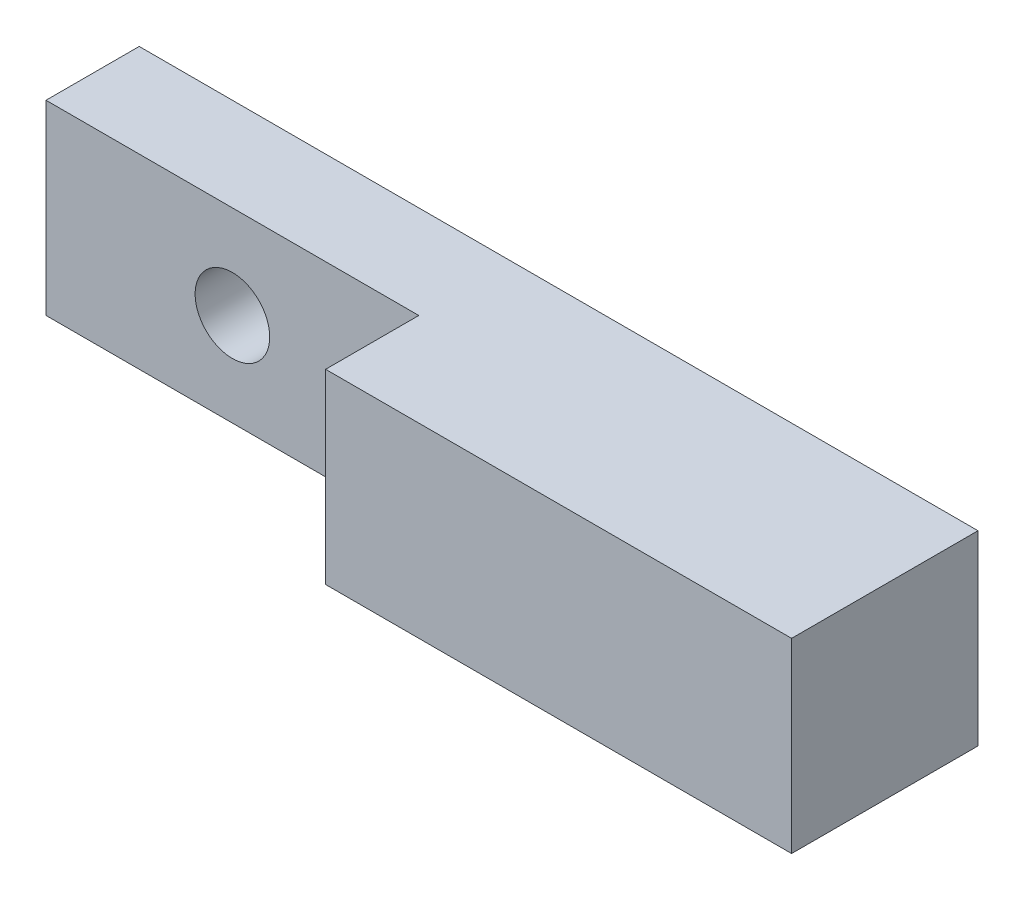
ISO-10303-21;
HEADER;
FILE_DESCRIPTION(('STEP AP214'),'2;1');
FILE_NAME('part.step','',(''),(''),'','','');
FILE_SCHEMA(('AUTOMOTIVE_DESIGN { 1 0 10303 214 1 1 1 1 }'));
ENDSEC;
DATA;
#1=APPLICATION_CONTEXT('core data for automotive mechanical design processes');
#2=APPLICATION_PROTOCOL_DEFINITION('international standard','automotive_design',2000,#1);
#3=PRODUCT_CONTEXT('',#1,'mechanical');
#4=PRODUCT('Part','Part','',(#3));
#5=PRODUCT_RELATED_PRODUCT_CATEGORY('part','',(#4));
#6=PRODUCT_DEFINITION_FORMATION('','',#4);
#7=PRODUCT_DEFINITION_CONTEXT('part definition',#1,'design');
#8=PRODUCT_DEFINITION('design','',#6,#7);
#9=PRODUCT_DEFINITION_SHAPE('','',#8);
#10=(LENGTH_UNIT() NAMED_UNIT(*) SI_UNIT(.MILLI.,.METRE.));
#11=(NAMED_UNIT(*) PLANE_ANGLE_UNIT() SI_UNIT($,.RADIAN.));
#12=(NAMED_UNIT(*) SI_UNIT($,.STERADIAN.) SOLID_ANGLE_UNIT());
#13=UNCERTAINTY_MEASURE_WITH_UNIT(LENGTH_MEASURE(1.E-05),#10,'distance_accuracy_value','');
#14=(GEOMETRIC_REPRESENTATION_CONTEXT(3) GLOBAL_UNCERTAINTY_ASSIGNED_CONTEXT((#13)) GLOBAL_UNIT_ASSIGNED_CONTEXT((#10,
#11,#12)) REPRESENTATION_CONTEXT('',''));
#15=CARTESIAN_POINT('',(0.,0.,0.));
#16=DIRECTION('',(0.,0.,1.));
#17=DIRECTION('',(1.,0.,0.));
#18=AXIS2_PLACEMENT_3D('',#15,#16,#17);
#19=CARTESIAN_POINT('',(0.,0.,10.));
#20=DIRECTION('',(1.,0.,0.));
#21=DIRECTION('',(0.,0.,-1.));
#22=AXIS2_PLACEMENT_3D('',#19,#20,#21);
#23=PLANE('',#22);
#24=DIRECTION('',(0.,-1.,0.));
#25=VECTOR('',#24,1.);
#26=CARTESIAN_POINT('',(0.,10.,5.));
#27=LINE('',#26,#25);
#28=CARTESIAN_POINT('',(0.,10.,5.));
#29=VERTEX_POINT('',#28);
#30=CARTESIAN_POINT('',(0.,0.,5.));
#31=VERTEX_POINT('',#30);
#32=EDGE_CURVE('E80',#29,#31,#27,.T.);
#33=ORIENTED_EDGE('',*,*,#32,.F.);
#34=DIRECTION('',(0.,0.,-1.));
#35=VECTOR('',#34,1.);
#36=CARTESIAN_POINT('',(0.,10.,10.));
#37=LINE('',#36,#35);
#38=CARTESIAN_POINT('',(0.,10.,0.));
#39=VERTEX_POINT('',#38);
#40=EDGE_CURVE('E74',#29,#39,#37,.T.);
#41=ORIENTED_EDGE('',*,*,#40,.T.);
#42=DIRECTION('',(0.,-1.,0.));
#43=VECTOR('',#42,1.);
#44=CARTESIAN_POINT('',(0.,0.,0.));
#45=LINE('',#44,#43);
#46=CARTESIAN_POINT('',(0.,0.,0.));
#47=VERTEX_POINT('',#46);
#48=EDGE_CURVE('E78',#39,#47,#45,.T.);
#49=ORIENTED_EDGE('',*,*,#48,.T.);
#50=DIRECTION('',(0.,0.,-1.));
#51=VECTOR('',#50,1.);
#52=CARTESIAN_POINT('',(0.,0.,10.));
#53=LINE('',#52,#51);
#54=EDGE_CURVE('E11',#31,#47,#53,.T.);
#55=ORIENTED_EDGE('',*,*,#54,.F.);
#56=EDGE_LOOP('',(#33,#41,#49,#55));
#57=FACE_BOUND('',#56,.T.);
#58=ADVANCED_FACE('F32',(#57),#23,.F.);
#59=CARTESIAN_POINT('',(0.,0.,10.));
#60=DIRECTION('',(0.,1.,0.));
#61=DIRECTION('',(0.,0.,1.));
#62=AXIS2_PLACEMENT_3D('',#59,#60,#61);
#63=PLANE('',#62);
#64=DIRECTION('',(1.,0.,0.));
#65=VECTOR('',#64,1.);
#66=CARTESIAN_POINT('',(0.,0.,10.));
#67=LINE('',#66,#65);
#68=CARTESIAN_POINT('',(20.,0.,10.));
#69=VERTEX_POINT('',#68);
#70=CARTESIAN_POINT('',(45.,0.,10.));
#71=VERTEX_POINT('',#70);
#72=EDGE_CURVE('E93',#69,#71,#67,.T.);
#73=ORIENTED_EDGE('',*,*,#72,.F.);
#74=DIRECTION('',(0.,0.,1.));
#75=VECTOR('',#74,1.);
#76=CARTESIAN_POINT('',(20.,0.,5.));
#77=LINE('',#76,#75);
#78=CARTESIAN_POINT('',(20.,0.,5.));
#79=VERTEX_POINT('',#78);
#80=EDGE_CURVE('E46',#79,#69,#77,.T.);
#81=ORIENTED_EDGE('',*,*,#80,.F.);
#82=DIRECTION('',(1.,0.,0.));
#83=VECTOR('',#82,1.);
#84=CARTESIAN_POINT('',(0.,0.,5.));
#85=LINE('',#84,#83);
#86=EDGE_CURVE('E118',#31,#79,#85,.T.);
#87=ORIENTED_EDGE('',*,*,#86,.F.);
#88=ORIENTED_EDGE('',*,*,#54,.T.);
#89=DIRECTION('',(1.,0.,0.));
#90=VECTOR('',#89,1.);
#91=CARTESIAN_POINT('',(0.,0.,0.));
#92=LINE('',#91,#90);
#93=CARTESIAN_POINT('',(45.,0.,0.));
#94=VERTEX_POINT('',#93);
#95=EDGE_CURVE('E98',#47,#94,#92,.T.);
#96=ORIENTED_EDGE('',*,*,#95,.T.);
#97=DIRECTION('',(0.,0.,-1.));
#98=VECTOR('',#97,1.);
#99=CARTESIAN_POINT('',(45.,0.,10.));
#100=LINE('',#99,#98);
#101=EDGE_CURVE('E39',#71,#94,#100,.T.);
#102=ORIENTED_EDGE('',*,*,#101,.F.);
#103=EDGE_LOOP('',(#73,#81,#87,#88,#96,#102));
#104=FACE_BOUND('',#103,.T.);
#105=ADVANCED_FACE('F114',(#104),#63,.F.);
#106=CARTESIAN_POINT('',(45.,0.,10.));
#107=DIRECTION('',(-1.,0.,0.));
#108=DIRECTION('',(0.,0.,1.));
#109=AXIS2_PLACEMENT_3D('',#106,#107,#108);
#110=PLANE('',#109);
#111=DIRECTION('',(0.,1.,0.));
#112=VECTOR('',#111,1.);
#113=CARTESIAN_POINT('',(45.,0.,0.));
#114=LINE('',#113,#112);
#115=CARTESIAN_POINT('',(45.,10.,0.));
#116=VERTEX_POINT('',#115);
#117=EDGE_CURVE('E94',#94,#116,#114,.T.);
#118=ORIENTED_EDGE('',*,*,#117,.T.);
#119=DIRECTION('',(0.,0.,-1.));
#120=VECTOR('',#119,1.);
#121=CARTESIAN_POINT('',(45.,10.,10.));
#122=LINE('',#121,#120);
#123=CARTESIAN_POINT('',(45.,10.,10.));
#124=VERTEX_POINT('',#123);
#125=EDGE_CURVE('E83',#124,#116,#122,.T.);
#126=ORIENTED_EDGE('',*,*,#125,.F.);
#127=DIRECTION('',(0.,1.,0.));
#128=VECTOR('',#127,1.);
#129=CARTESIAN_POINT('',(45.,0.,10.));
#130=LINE('',#129,#128);
#131=EDGE_CURVE('E55',#71,#124,#130,.T.);
#132=ORIENTED_EDGE('',*,*,#131,.F.);
#133=ORIENTED_EDGE('',*,*,#101,.T.);
#134=EDGE_LOOP('',(#118,#126,#132,#133));
#135=FACE_BOUND('',#134,.T.);
#136=ADVANCED_FACE('F111',(#135),#110,.F.);
#137=CARTESIAN_POINT('',(0.,10.,10.));
#138=DIRECTION('',(0.,-1.,0.));
#139=DIRECTION('',(0.,0.,-1.));
#140=AXIS2_PLACEMENT_3D('',#137,#138,#139);
#141=PLANE('',#140);
#142=DIRECTION('',(-1.,0.,0.));
#143=VECTOR('',#142,1.);
#144=CARTESIAN_POINT('',(0.,10.,5.));
#145=LINE('',#144,#143);
#146=CARTESIAN_POINT('',(20.,10.,5.));
#147=VERTEX_POINT('',#146);
#148=EDGE_CURVE('E130',#147,#29,#145,.T.);
#149=ORIENTED_EDGE('',*,*,#148,.F.);
#150=DIRECTION('',(0.,0.,1.));
#151=VECTOR('',#150,1.);
#152=CARTESIAN_POINT('',(20.,10.,5.));
#153=LINE('',#152,#151);
#154=CARTESIAN_POINT('',(20.,10.,10.));
#155=VERTEX_POINT('',#154);
#156=EDGE_CURVE('E99',#147,#155,#153,.T.);
#157=ORIENTED_EDGE('',*,*,#156,.T.);
#158=DIRECTION('',(-1.,0.,0.));
#159=VECTOR('',#158,1.);
#160=CARTESIAN_POINT('',(0.,10.,10.));
#161=LINE('',#160,#159);
#162=EDGE_CURVE('E84',#124,#155,#161,.T.);
#163=ORIENTED_EDGE('',*,*,#162,.F.);
#164=ORIENTED_EDGE('',*,*,#125,.T.);
#165=DIRECTION('',(-1.,0.,0.));
#166=VECTOR('',#165,1.);
#167=CARTESIAN_POINT('',(0.,10.,0.));
#168=LINE('',#167,#166);
#169=EDGE_CURVE('E88',#116,#39,#168,.T.);
#170=ORIENTED_EDGE('',*,*,#169,.T.);
#171=ORIENTED_EDGE('',*,*,#40,.F.);
#172=EDGE_LOOP('',(#149,#157,#163,#164,#170,#171));
#173=FACE_BOUND('',#172,.T.);
#174=ADVANCED_FACE('F89',(#173),#141,.F.);
#175=CARTESIAN_POINT('',(0.,0.,10.));
#176=DIRECTION('',(0.,0.,-1.));
#177=DIRECTION('',(-1.,0.,0.));
#178=AXIS2_PLACEMENT_3D('',#175,#176,#177);
#179=PLANE('',#178);
#180=ORIENTED_EDGE('',*,*,#162,.T.);
#181=DIRECTION('',(0.,1.,0.));
#182=VECTOR('',#181,1.);
#183=CARTESIAN_POINT('',(20.,10.,10.));
#184=LINE('',#183,#182);
#185=EDGE_CURVE('E138',#69,#155,#184,.T.);
#186=ORIENTED_EDGE('',*,*,#185,.F.);
#187=ORIENTED_EDGE('',*,*,#72,.T.);
#188=ORIENTED_EDGE('',*,*,#131,.T.);
#189=EDGE_LOOP('',(#180,#186,#187,#188));
#190=FACE_BOUND('',#189,.T.);
#191=ADVANCED_FACE('F141',(#190),#179,.F.);
#192=CARTESIAN_POINT('',(0.,0.,0.));
#193=DIRECTION('',(0.,0.,-1.));
#194=DIRECTION('',(-1.,0.,0.));
#195=AXIS2_PLACEMENT_3D('',#192,#193,#194);
#196=PLANE('',#195);
#197=CARTESIAN_POINT('',(10.,5.,0.));
#198=DIRECTION('',(0.,0.,1.));
#199=DIRECTION('',(1.,0.,0.));
#200=AXIS2_PLACEMENT_3D('',#197,#198,#199);
#201=CIRCLE('',#200,2.);
#202=CARTESIAN_POINT('',(12.,5.,0.));
#203=VERTEX_POINT('',#202);
#204=EDGE_CURVE('E139',#203,#203,#201,.T.);
#205=ORIENTED_EDGE('',*,*,#204,.T.);
#206=EDGE_LOOP('',(#205));
#207=FACE_BOUND('',#206,.T.);
#208=ORIENTED_EDGE('',*,*,#48,.F.);
#209=ORIENTED_EDGE('',*,*,#169,.F.);
#210=ORIENTED_EDGE('',*,*,#117,.F.);
#211=ORIENTED_EDGE('',*,*,#95,.F.);
#212=EDGE_LOOP('',(#208,#209,#210,#211));
#213=FACE_BOUND('',#212,.T.);
#214=ADVANCED_FACE('F97',(#207,#213),#196,.T.);
#215=CARTESIAN_POINT('',(20.,10.,5.));
#216=DIRECTION('',(1.,0.,0.));
#217=DIRECTION('',(0.,0.,-1.));
#218=AXIS2_PLACEMENT_3D('',#215,#216,#217);
#219=PLANE('',#218);
#220=ORIENTED_EDGE('',*,*,#185,.T.);
#221=ORIENTED_EDGE('',*,*,#156,.F.);
#222=DIRECTION('',(0.,1.,0.));
#223=VECTOR('',#222,1.);
#224=CARTESIAN_POINT('',(20.,10.,5.));
#225=LINE('',#224,#223);
#226=EDGE_CURVE('E132',#79,#147,#225,.T.);
#227=ORIENTED_EDGE('',*,*,#226,.F.);
#228=ORIENTED_EDGE('',*,*,#80,.T.);
#229=EDGE_LOOP('',(#220,#221,#227,#228));
#230=FACE_BOUND('',#229,.T.);
#231=ADVANCED_FACE('F142',(#230),#219,.F.);
#232=CARTESIAN_POINT('',(0.,0.,5.));
#233=DIRECTION('',(0.,0.,1.));
#234=DIRECTION('',(1.,0.,0.));
#235=AXIS2_PLACEMENT_3D('',#232,#233,#234);
#236=PLANE('',#235);
#237=CARTESIAN_POINT('',(10.,5.,5.));
#238=DIRECTION('',(0.,0.,1.));
#239=DIRECTION('',(1.,0.,0.));
#240=AXIS2_PLACEMENT_3D('',#237,#238,#239);
#241=CIRCLE('',#240,2.);
#242=CARTESIAN_POINT('',(12.,5.,5.));
#243=VERTEX_POINT('',#242);
#244=EDGE_CURVE('E145',#243,#243,#241,.T.);
#245=ORIENTED_EDGE('',*,*,#244,.F.);
#246=EDGE_LOOP('',(#245));
#247=FACE_BOUND('',#246,.T.);
#248=ORIENTED_EDGE('',*,*,#32,.T.);
#249=ORIENTED_EDGE('',*,*,#86,.T.);
#250=ORIENTED_EDGE('',*,*,#226,.T.);
#251=ORIENTED_EDGE('',*,*,#148,.T.);
#252=EDGE_LOOP('',(#248,#249,#250,#251));
#253=FACE_BOUND('',#252,.T.);
#254=ADVANCED_FACE('F131',(#247,#253),#236,.T.);
#255=CARTESIAN_POINT('',(10.,5.,0.));
#256=DIRECTION('',(0.,0.,1.));
#257=DIRECTION('',(1.,0.,0.));
#258=AXIS2_PLACEMENT_3D('',#255,#256,#257);
#259=CYLINDRICAL_SURFACE('',#258,2.);
#260=ORIENTED_EDGE('',*,*,#204,.F.);
#261=EDGE_LOOP('',(#260));
#262=FACE_BOUND('',#261,.T.);
#263=ORIENTED_EDGE('',*,*,#244,.T.);
#264=EDGE_LOOP('',(#263));
#265=FACE_BOUND('',#264,.T.);
#266=ADVANCED_FACE('F152',(#262,#265),#259,.F.);
#267=CLOSED_SHELL('',(#58,#105,#136,#174,#191,#214,#231,#254,#266));
#268=MANIFOLD_SOLID_BREP('B2',#267);
#269=ADVANCED_BREP_SHAPE_REPRESENTATION('',(#18,#268),#14);
#270=SHAPE_DEFINITION_REPRESENTATION(#9,#269);
ENDSEC;
END-ISO-10303-21;
